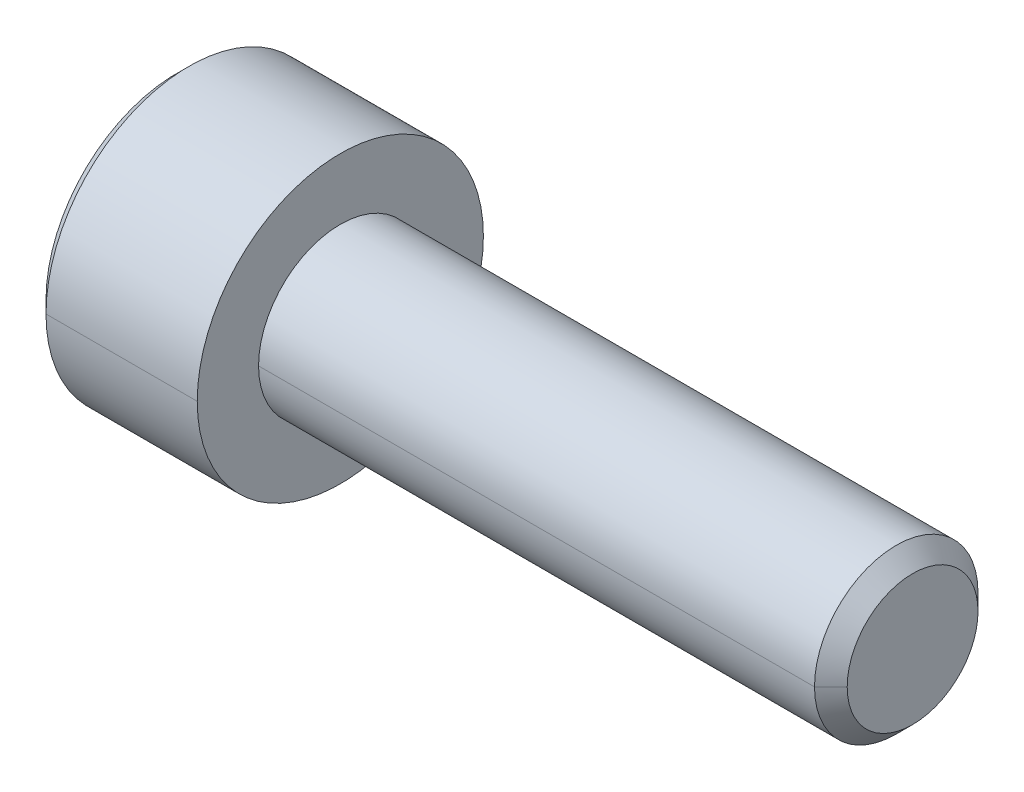
ISO-10303-21;
HEADER;
FILE_DESCRIPTION(('STEP AP214'),'2;1');
FILE_NAME('part.step','',(''),(''),'','','');
FILE_SCHEMA(('AUTOMOTIVE_DESIGN { 1 0 10303 214 1 1 1 1 }'));
ENDSEC;
DATA;
#1=APPLICATION_CONTEXT('core data for automotive mechanical design processes');
#2=APPLICATION_PROTOCOL_DEFINITION('international standard','automotive_design',2000,#1);
#3=PRODUCT_CONTEXT('',#1,'mechanical');
#4=PRODUCT('Part','Part','',(#3));
#5=PRODUCT_RELATED_PRODUCT_CATEGORY('part','',(#4));
#6=PRODUCT_DEFINITION_FORMATION('','',#4);
#7=PRODUCT_DEFINITION_CONTEXT('part definition',#1,'design');
#8=PRODUCT_DEFINITION('design','',#6,#7);
#9=PRODUCT_DEFINITION_SHAPE('','',#8);
#10=(LENGTH_UNIT() NAMED_UNIT(*) SI_UNIT(.MILLI.,.METRE.));
#11=(NAMED_UNIT(*) PLANE_ANGLE_UNIT() SI_UNIT($,.RADIAN.));
#12=(NAMED_UNIT(*) SI_UNIT($,.STERADIAN.) SOLID_ANGLE_UNIT());
#13=UNCERTAINTY_MEASURE_WITH_UNIT(LENGTH_MEASURE(1.E-05),#10,'distance_accuracy_value','');
#14=(GEOMETRIC_REPRESENTATION_CONTEXT(3) GLOBAL_UNCERTAINTY_ASSIGNED_CONTEXT((#13)) GLOBAL_UNIT_ASSIGNED_CONTEXT((#10,
#11,#12)) REPRESENTATION_CONTEXT('',''));
#15=CARTESIAN_POINT('',(0.,0.,0.));
#16=DIRECTION('',(0.,0.,1.));
#17=DIRECTION('',(1.,0.,0.));
#18=AXIS2_PLACEMENT_3D('',#15,#16,#17);
#19=CARTESIAN_POINT('',(-11.8339100346021,5.46584891523466,3.15570934256055));
#20=DIRECTION('',(0.882352941176471,-0.407541366486795,-0.235294117647059));
#21=DIRECTION('',(0.,0.5,-0.866025403784439));
#22=AXIS2_PLACEMENT_3D('',#19,#20,#21);
#23=PLANE('',#22);
#24=DIRECTION('',(0.419313934688767,0.453920649501602,0.786213627541439));
#25=VECTOR('',#24,1.);
#26=CARTESIAN_POINT('',(-16.,-0.866025403784439,-1.5));
#27=LINE('',#26,#25);
#28=CARTESIAN_POINT('',(-16.,-0.866025403784439,-1.5));
#29=VERTEX_POINT('',#28);
#30=CARTESIAN_POINT('',(-15.2,0.,0.));
#31=VERTEX_POINT('',#30);
#32=EDGE_CURVE('E157',#29,#31,#27,.T.);
#33=ORIENTED_EDGE('',*,*,#32,.F.);
#34=CARTESIAN_POINT('',(-16.,-0.866025403784439,-1.5));
#35=CARTESIAN_POINT('',(-16.,-1.15470053837925,-1.));
#36=CARTESIAN_POINT('',(-16.,-1.44337567297406,-0.5));
#37=CARTESIAN_POINT('',(-16.,-1.73205080756888,0.));
#38=(BOUNDED_CURVE() B_SPLINE_CURVE(3,(#34,#35,#36,#37),.UNSPECIFIED.,.F.,
.F.) B_SPLINE_CURVE_WITH_KNOTS((4,4),(0.,1.),
.UNSPECIFIED.) CURVE() GEOMETRIC_REPRESENTATION_ITEM() RATIONAL_B_SPLINE_CURVE((1.,1.,1.,1.)) REPRESENTATION_ITEM(''));
#39=CARTESIAN_POINT('',(-16.,-1.73205080756888,0.));
#40=VERTEX_POINT('',#39);
#41=EDGE_CURVE('E256',#29,#40,#38,.T.);
#42=ORIENTED_EDGE('',*,*,#41,.T.);
#43=DIRECTION('',(0.419313934688767,0.907841299003204,0.));
#44=VECTOR('',#43,1.);
#45=CARTESIAN_POINT('',(-16.,-1.73205080756888,0.));
#46=LINE('',#45,#44);
#47=EDGE_CURVE('E10',#40,#31,#46,.T.);
#48=ORIENTED_EDGE('',*,*,#47,.T.);
#49=EDGE_LOOP('',(#33,#42,#48));
#50=FACE_BOUND('',#49,.T.);
#51=ADVANCED_FACE('F16',(#50),#23,.F.);
#52=CARTESIAN_POINT('',(-11.8339100346021,5.46584891523466,-3.15570934256055));
#53=DIRECTION('',(0.882352941176471,-0.407541366486795,0.235294117647059));
#54=DIRECTION('',(0.,-0.5,-0.866025403784439));
#55=AXIS2_PLACEMENT_3D('',#52,#53,#54);
#56=PLANE('',#55);
#57=ORIENTED_EDGE('',*,*,#47,.F.);
#58=CARTESIAN_POINT('',(-16.,-1.73205080756888,0.));
#59=CARTESIAN_POINT('',(-16.,-1.44337567297407,0.5));
#60=CARTESIAN_POINT('',(-16.,-1.15470053837925,1.));
#61=CARTESIAN_POINT('',(-16.,-0.86602540378444,1.5));
#62=(BOUNDED_CURVE() B_SPLINE_CURVE(3,(#58,#59,#60,#61),.UNSPECIFIED.,.F.,
.F.) B_SPLINE_CURVE_WITH_KNOTS((4,4),(0.,1.),
.UNSPECIFIED.) CURVE() GEOMETRIC_REPRESENTATION_ITEM() RATIONAL_B_SPLINE_CURVE((1.,1.,1.,1.)) REPRESENTATION_ITEM(''));
#63=CARTESIAN_POINT('',(-16.,-0.86602540378444,1.5));
#64=VERTEX_POINT('',#63);
#65=EDGE_CURVE('E274',#40,#64,#62,.T.);
#66=ORIENTED_EDGE('',*,*,#65,.T.);
#67=DIRECTION('',(0.419313934688767,0.453920649501602,-0.786213627541438));
#68=VECTOR('',#67,1.);
#69=CARTESIAN_POINT('',(-16.,-0.86602540378444,1.5));
#70=LINE('',#69,#68);
#71=EDGE_CURVE('E27',#64,#31,#70,.T.);
#72=ORIENTED_EDGE('',*,*,#71,.T.);
#73=EDGE_LOOP('',(#57,#66,#72));
#74=FACE_BOUND('',#73,.T.);
#75=ADVANCED_FACE('F589',(#74),#56,.F.);
#76=CARTESIAN_POINT('',(-11.8339100346021,0.,-6.31141868512111));
#77=DIRECTION('',(0.882352941176471,0.,0.470588235294118));
#78=DIRECTION('',(0.,-1.,0.));
#79=AXIS2_PLACEMENT_3D('',#76,#77,#78);
#80=PLANE('',#79);
#81=ORIENTED_EDGE('',*,*,#71,.F.);
#82=CARTESIAN_POINT('',(-16.,-0.86602540378444,1.5));
#83=CARTESIAN_POINT('',(-16.,-0.288675134594814,1.5));
#84=CARTESIAN_POINT('',(-16.,0.288675134594813,1.5));
#85=CARTESIAN_POINT('',(-16.,0.866025403784439,1.5));
#86=(BOUNDED_CURVE() B_SPLINE_CURVE(3,(#82,#83,#84,#85),.UNSPECIFIED.,.F.,
.F.) B_SPLINE_CURVE_WITH_KNOTS((4,4),(0.,1.),
.UNSPECIFIED.) CURVE() GEOMETRIC_REPRESENTATION_ITEM() RATIONAL_B_SPLINE_CURVE((1.,1.,1.,1.)) REPRESENTATION_ITEM(''));
#87=CARTESIAN_POINT('',(-16.,0.866025403784439,1.5));
#88=VERTEX_POINT('',#87);
#89=EDGE_CURVE('E160',#64,#88,#86,.T.);
#90=ORIENTED_EDGE('',*,*,#89,.T.);
#91=DIRECTION('',(0.419313934688767,-0.453920649501602,-0.786213627541439));
#92=VECTOR('',#91,1.);
#93=CARTESIAN_POINT('',(-16.,0.866025403784439,1.5));
#94=LINE('',#93,#92);
#95=EDGE_CURVE('E149',#88,#31,#94,.T.);
#96=ORIENTED_EDGE('',*,*,#95,.T.);
#97=EDGE_LOOP('',(#81,#90,#96));
#98=FACE_BOUND('',#97,.T.);
#99=ADVANCED_FACE('F162',(#98),#80,.F.);
#100=CARTESIAN_POINT('',(-11.8339100346021,-5.46584891523466,-3.15570934256055));
#101=DIRECTION('',(0.882352941176471,0.407541366486795,0.235294117647059));
#102=DIRECTION('',(0.,0.5,-0.866025403784439));
#103=AXIS2_PLACEMENT_3D('',#100,#101,#102);
#104=PLANE('',#103);
#105=ORIENTED_EDGE('',*,*,#95,.F.);
#106=CARTESIAN_POINT('',(-16.,0.866025403784439,1.5));
#107=CARTESIAN_POINT('',(-16.,1.15470053837925,1.));
#108=CARTESIAN_POINT('',(-16.,1.44337567297406,0.5));
#109=CARTESIAN_POINT('',(-16.,1.73205080756888,0.));
#110=(BOUNDED_CURVE() B_SPLINE_CURVE(3,(#106,#107,#108,#109),.UNSPECIFIED.,.F.,
.F.) B_SPLINE_CURVE_WITH_KNOTS((4,4),(0.,1.),
.UNSPECIFIED.) CURVE() GEOMETRIC_REPRESENTATION_ITEM() RATIONAL_B_SPLINE_CURVE((1.,1.,1.,1.)) REPRESENTATION_ITEM(''));
#111=CARTESIAN_POINT('',(-16.,1.73205080756888,0.));
#112=VERTEX_POINT('',#111);
#113=EDGE_CURVE('E153',#88,#112,#110,.T.);
#114=ORIENTED_EDGE('',*,*,#113,.T.);
#115=DIRECTION('',(0.419313934688767,-0.907841299003204,0.));
#116=VECTOR('',#115,1.);
#117=CARTESIAN_POINT('',(-16.,1.73205080756888,0.));
#118=LINE('',#117,#116);
#119=EDGE_CURVE('E20',#112,#31,#118,.T.);
#120=ORIENTED_EDGE('',*,*,#119,.T.);
#121=EDGE_LOOP('',(#105,#114,#120));
#122=FACE_BOUND('',#121,.T.);
#123=ADVANCED_FACE('F151',(#122),#104,.F.);
#124=CARTESIAN_POINT('',(-11.8339100346021,0.,6.31141868512111));
#125=DIRECTION('',(0.882352941176471,0.,-0.470588235294118));
#126=DIRECTION('',(0.,-1.,0.));
#127=AXIS2_PLACEMENT_3D('',#124,#125,#126);
#128=PLANE('',#127);
#129=DIRECTION('',(0.419313934688767,-0.453920649501602,0.786213627541439));
#130=VECTOR('',#129,1.);
#131=CARTESIAN_POINT('',(-16.,0.866025403784439,-1.5));
#132=LINE('',#131,#130);
#133=CARTESIAN_POINT('',(-16.,0.866025403784439,-1.5));
#134=VERTEX_POINT('',#133);
#135=EDGE_CURVE('E213',#134,#31,#132,.T.);
#136=ORIENTED_EDGE('',*,*,#135,.F.);
#137=CARTESIAN_POINT('',(-16.,0.866025403784439,-1.5));
#138=CARTESIAN_POINT('',(-16.,0.288675134594813,-1.5));
#139=CARTESIAN_POINT('',(-16.,-0.288675134594813,-1.5));
#140=CARTESIAN_POINT('',(-16.,-0.866025403784439,-1.5));
#141=(BOUNDED_CURVE() B_SPLINE_CURVE(3,(#137,#138,#139,#140),.UNSPECIFIED.,.F.,
.F.) B_SPLINE_CURVE_WITH_KNOTS((4,4),(0.,1.),
.UNSPECIFIED.) CURVE() GEOMETRIC_REPRESENTATION_ITEM() RATIONAL_B_SPLINE_CURVE((1.,1.,1.,1.)) REPRESENTATION_ITEM(''));
#142=EDGE_CURVE('E190',#134,#29,#141,.T.);
#143=ORIENTED_EDGE('',*,*,#142,.T.);
#144=ORIENTED_EDGE('',*,*,#32,.T.);
#145=EDGE_LOOP('',(#136,#143,#144));
#146=FACE_BOUND('',#145,.T.);
#147=ADVANCED_FACE('F623',(#146),#128,.F.);
#148=CARTESIAN_POINT('',(-11.8339100346021,-5.46584891523466,3.15570934256055));
#149=DIRECTION('',(0.882352941176471,0.407541366486795,-0.235294117647059));
#150=DIRECTION('',(0.,-0.5,-0.866025403784439));
#151=AXIS2_PLACEMENT_3D('',#148,#149,#150);
#152=PLANE('',#151);
#153=ORIENTED_EDGE('',*,*,#119,.F.);
#154=CARTESIAN_POINT('',(-16.,1.73205080756888,0.));
#155=CARTESIAN_POINT('',(-16.,1.44337567297406,-0.5));
#156=CARTESIAN_POINT('',(-16.,1.15470053837925,-1.));
#157=CARTESIAN_POINT('',(-16.,0.866025403784439,-1.5));
#158=(BOUNDED_CURVE() B_SPLINE_CURVE(3,(#154,#155,#156,#157),.UNSPECIFIED.,.F.,
.F.) B_SPLINE_CURVE_WITH_KNOTS((4,4),(0.,1.),
.UNSPECIFIED.) CURVE() GEOMETRIC_REPRESENTATION_ITEM() RATIONAL_B_SPLINE_CURVE((1.,1.,1.,1.)) REPRESENTATION_ITEM(''));
#159=EDGE_CURVE('E207',#112,#134,#158,.T.);
#160=ORIENTED_EDGE('',*,*,#159,.T.);
#161=ORIENTED_EDGE('',*,*,#135,.T.);
#162=EDGE_LOOP('',(#153,#160,#161));
#163=FACE_BOUND('',#162,.T.);
#164=ADVANCED_FACE('F617',(#163),#152,.F.);
#165=CARTESIAN_POINT('',(-18.,0.,0.));
#166=DIRECTION('',(1.,0.,0.));
#167=DIRECTION('',(0.,0.,-1.));
#168=AXIS2_PLACEMENT_3D('',#165,#166,#167);
#169=CONICAL_SURFACE('',#168,3.2,0.785398163397441);
#170=DIRECTION('',(0.707106781186553,0.,0.707106781186543));
#171=VECTOR('',#170,1.);
#172=CARTESIAN_POINT('',(-18.,0.,3.2));
#173=LINE('',#172,#171);
#174=CARTESIAN_POINT('',(-18.,0.,3.2));
#175=VERTEX_POINT('',#174);
#176=CARTESIAN_POINT('',(-17.7,0.,3.5));
#177=VERTEX_POINT('',#176);
#178=EDGE_CURVE('E202',#175,#177,#173,.T.);
#179=ORIENTED_EDGE('',*,*,#178,.F.);
#180=CARTESIAN_POINT('',(-18.,0.,0.));
#181=DIRECTION('',(-1.,0.,0.));
#182=DIRECTION('',(0.,0.,-1.));
#183=AXIS2_PLACEMENT_3D('',#180,#181,#182);
#184=CIRCLE('',#183,3.2);
#185=CARTESIAN_POINT('',(-18.,0.,-3.2));
#186=VERTEX_POINT('',#185);
#187=EDGE_CURVE('E394',#186,#175,#184,.T.);
#188=ORIENTED_EDGE('',*,*,#187,.F.);
#189=DIRECTION('',(0.707106781186553,0.,-0.707106781186543));
#190=VECTOR('',#189,1.);
#191=CARTESIAN_POINT('',(-18.,0.,-3.2));
#192=LINE('',#191,#190);
#193=CARTESIAN_POINT('',(-17.7,0.,-3.5));
#194=VERTEX_POINT('',#193);
#195=EDGE_CURVE('E201',#186,#194,#192,.T.);
#196=ORIENTED_EDGE('',*,*,#195,.T.);
#197=CARTESIAN_POINT('',(-17.7,0.,0.));
#198=DIRECTION('',(1.,0.,0.));
#199=DIRECTION('',(0.,0.,-1.));
#200=AXIS2_PLACEMENT_3D('',#197,#198,#199);
#201=CIRCLE('',#200,3.5);
#202=EDGE_CURVE('E359',#177,#194,#201,.T.);
#203=ORIENTED_EDGE('',*,*,#202,.F.);
#204=EDGE_LOOP('',(#179,#188,#196,#203));
#205=FACE_BOUND('',#204,.T.);
#206=ADVANCED_FACE('F567',(#205),#169,.T.);
#207=CARTESIAN_POINT('',(-16.,1.73205080756888,0.));
#208=DIRECTION('',(0.,0.866025403784439,-0.5));
#209=DIRECTION('',(-1.,0.,0.));
#210=AXIS2_PLACEMENT_3D('',#207,#208,#209);
#211=PLANE('',#210);
#212=DIRECTION('',(0.,-0.5,-0.866025403784439));
#213=VECTOR('',#212,1.);
#214=CARTESIAN_POINT('',(-18.,1.73205080756888,0.));
#215=LINE('',#214,#213);
#216=CARTESIAN_POINT('',(-18.,1.73205080756888,0.));
#217=VERTEX_POINT('',#216);
#218=CARTESIAN_POINT('',(-18.,0.866025403784439,-1.5));
#219=VERTEX_POINT('',#218);
#220=EDGE_CURVE('E390',#217,#219,#215,.T.);
#221=ORIENTED_EDGE('',*,*,#220,.T.);
#222=DIRECTION('',(-1.,0.,0.));
#223=VECTOR('',#222,1.);
#224=CARTESIAN_POINT('',(-16.,0.866025403784439,-1.5));
#225=LINE('',#224,#223);
#226=EDGE_CURVE('E212',#134,#219,#225,.T.);
#227=ORIENTED_EDGE('',*,*,#226,.F.);
#228=ORIENTED_EDGE('',*,*,#159,.F.);
#229=DIRECTION('',(-1.,0.,0.));
#230=VECTOR('',#229,1.);
#231=CARTESIAN_POINT('',(-16.,1.73205080756888,0.));
#232=LINE('',#231,#230);
#233=EDGE_CURVE('E100',#112,#217,#232,.T.);
#234=ORIENTED_EDGE('',*,*,#233,.T.);
#235=EDGE_LOOP('',(#221,#227,#228,#234));
#236=FACE_BOUND('',#235,.T.);
#237=ADVANCED_FACE('F616',(#236),#211,.F.);
#238=CARTESIAN_POINT('',(-16.,0.866025403784439,-1.5));
#239=DIRECTION('',(0.,0.,-1.));
#240=DIRECTION('',(0.,-1.,0.));
#241=AXIS2_PLACEMENT_3D('',#238,#239,#240);
#242=PLANE('',#241);
#243=DIRECTION('',(0.,-1.,0.));
#244=VECTOR('',#243,1.);
#245=CARTESIAN_POINT('',(-18.,0.866025403784439,-1.5));
#246=LINE('',#245,#244);
#247=CARTESIAN_POINT('',(-18.,-0.866025403784439,-1.5));
#248=VERTEX_POINT('',#247);
#249=EDGE_CURVE('E184',#219,#248,#246,.T.);
#250=ORIENTED_EDGE('',*,*,#249,.T.);
#251=DIRECTION('',(-1.,0.,0.));
#252=VECTOR('',#251,1.);
#253=CARTESIAN_POINT('',(-16.,-0.866025403784439,-1.5));
#254=LINE('',#253,#252);
#255=EDGE_CURVE('E249',#29,#248,#254,.T.);
#256=ORIENTED_EDGE('',*,*,#255,.F.);
#257=ORIENTED_EDGE('',*,*,#142,.F.);
#258=ORIENTED_EDGE('',*,*,#226,.T.);
#259=EDGE_LOOP('',(#250,#256,#257,#258));
#260=FACE_BOUND('',#259,.T.);
#261=ADVANCED_FACE('F622',(#260),#242,.F.);
#262=CARTESIAN_POINT('',(-16.,-0.866025403784439,-1.5));
#263=DIRECTION('',(0.,-0.866025403784439,-0.5));
#264=DIRECTION('',(0.,0.5,-0.866025403784439));
#265=AXIS2_PLACEMENT_3D('',#262,#263,#264);
#266=PLANE('',#265);
#267=DIRECTION('',(0.,-0.5,0.866025403784439));
#268=VECTOR('',#267,1.);
#269=CARTESIAN_POINT('',(-18.,-0.866025403784439,-1.5));
#270=LINE('',#269,#268);
#271=CARTESIAN_POINT('',(-18.,-1.73205080756888,0.));
#272=VERTEX_POINT('',#271);
#273=EDGE_CURVE('E365',#248,#272,#270,.T.);
#274=ORIENTED_EDGE('',*,*,#273,.T.);
#275=DIRECTION('',(-1.,0.,0.));
#276=VECTOR('',#275,1.);
#277=CARTESIAN_POINT('',(-16.,-1.73205080756888,0.));
#278=LINE('',#277,#276);
#279=EDGE_CURVE('E265',#40,#272,#278,.T.);
#280=ORIENTED_EDGE('',*,*,#279,.F.);
#281=ORIENTED_EDGE('',*,*,#41,.F.);
#282=ORIENTED_EDGE('',*,*,#255,.T.);
#283=EDGE_LOOP('',(#274,#280,#281,#282));
#284=FACE_BOUND('',#283,.T.);
#285=ADVANCED_FACE('F613',(#284),#266,.F.);
#286=CARTESIAN_POINT('',(-16.,-1.73205080756888,0.));
#287=DIRECTION('',(0.,-0.866025403784439,0.5));
#288=DIRECTION('',(-1.,0.,0.));
#289=AXIS2_PLACEMENT_3D('',#286,#287,#288);
#290=PLANE('',#289);
#291=DIRECTION('',(0.,0.5,0.866025403784439));
#292=VECTOR('',#291,1.);
#293=CARTESIAN_POINT('',(-18.,-1.73205080756888,0.));
#294=LINE('',#293,#292);
#295=CARTESIAN_POINT('',(-18.,-0.86602540378444,1.5));
#296=VERTEX_POINT('',#295);
#297=EDGE_CURVE('E339',#272,#296,#294,.T.);
#298=ORIENTED_EDGE('',*,*,#297,.T.);
#299=DIRECTION('',(-1.,0.,0.));
#300=VECTOR('',#299,1.);
#301=CARTESIAN_POINT('',(-16.,-0.86602540378444,1.5));
#302=LINE('',#301,#300);
#303=EDGE_CURVE('E166',#64,#296,#302,.T.);
#304=ORIENTED_EDGE('',*,*,#303,.F.);
#305=ORIENTED_EDGE('',*,*,#65,.F.);
#306=ORIENTED_EDGE('',*,*,#279,.T.);
#307=EDGE_LOOP('',(#298,#304,#305,#306));
#308=FACE_BOUND('',#307,.T.);
#309=ADVANCED_FACE('F609',(#308),#290,.F.);
#310=CARTESIAN_POINT('',(-16.,-0.86602540378444,1.5));
#311=DIRECTION('',(0.,0.,1.));
#312=DIRECTION('',(0.,-1.,0.));
#313=AXIS2_PLACEMENT_3D('',#310,#311,#312);
#314=PLANE('',#313);
#315=DIRECTION('',(0.,1.,0.));
#316=VECTOR('',#315,1.);
#317=CARTESIAN_POINT('',(-18.,-0.86602540378444,1.5));
#318=LINE('',#317,#316);
#319=CARTESIAN_POINT('',(-18.,0.866025403784439,1.5));
#320=VERTEX_POINT('',#319);
#321=EDGE_CURVE('E172',#296,#320,#318,.T.);
#322=ORIENTED_EDGE('',*,*,#321,.T.);
#323=DIRECTION('',(-1.,0.,0.));
#324=VECTOR('',#323,1.);
#325=CARTESIAN_POINT('',(-16.,0.866025403784439,1.5));
#326=LINE('',#325,#324);
#327=EDGE_CURVE('E167',#88,#320,#326,.T.);
#328=ORIENTED_EDGE('',*,*,#327,.F.);
#329=ORIENTED_EDGE('',*,*,#89,.F.);
#330=ORIENTED_EDGE('',*,*,#303,.T.);
#331=EDGE_LOOP('',(#322,#328,#329,#330));
#332=FACE_BOUND('',#331,.T.);
#333=ADVANCED_FACE('F170',(#332),#314,.F.);
#334=CARTESIAN_POINT('',(-16.,0.866025403784439,1.5));
#335=DIRECTION('',(0.,0.866025403784439,0.5));
#336=DIRECTION('',(1.,0.,0.));
#337=AXIS2_PLACEMENT_3D('',#334,#335,#336);
#338=PLANE('',#337);
#339=DIRECTION('',(0.,0.5,-0.866025403784439));
#340=VECTOR('',#339,1.);
#341=CARTESIAN_POINT('',(-18.,0.866025403784439,1.5));
#342=LINE('',#341,#340);
#343=EDGE_CURVE('E340',#320,#217,#342,.T.);
#344=ORIENTED_EDGE('',*,*,#343,.T.);
#345=ORIENTED_EDGE('',*,*,#233,.F.);
#346=ORIENTED_EDGE('',*,*,#113,.F.);
#347=ORIENTED_EDGE('',*,*,#327,.T.);
#348=EDGE_LOOP('',(#344,#345,#346,#347));
#349=FACE_BOUND('',#348,.T.);
#350=ADVANCED_FACE('F177',(#349),#338,.F.);
#351=CARTESIAN_POINT('',(-0.4,0.,0.));
#352=DIRECTION('',(-1.,0.,0.));
#353=DIRECTION('',(0.,0.,1.));
#354=AXIS2_PLACEMENT_3D('',#351,#352,#353);
#355=CONICAL_SURFACE('',#354,2.,0.785398163397452);
#356=DIRECTION('',(-0.707106781186545,0.,-0.707106781186551));
#357=VECTOR('',#356,1.);
#358=CARTESIAN_POINT('',(-0.4,0.,-2.));
#359=LINE('',#358,#357);
#360=CARTESIAN_POINT('',(0.,0.,-1.6));
#361=VERTEX_POINT('',#360);
#362=CARTESIAN_POINT('',(-0.4,0.,-2.));
#363=VERTEX_POINT('',#362);
#364=EDGE_CURVE('E428',#361,#363,#359,.T.);
#365=ORIENTED_EDGE('',*,*,#364,.F.);
#366=CARTESIAN_POINT('',(0.,0.,0.));
#367=DIRECTION('',(1.,0.,0.));
#368=DIRECTION('',(0.,0.,1.));
#369=AXIS2_PLACEMENT_3D('',#366,#367,#368);
#370=CIRCLE('',#369,1.6);
#371=CARTESIAN_POINT('',(0.,0.,1.6));
#372=VERTEX_POINT('',#371);
#373=EDGE_CURVE('E329',#372,#361,#370,.T.);
#374=ORIENTED_EDGE('',*,*,#373,.F.);
#375=DIRECTION('',(-0.707106781186545,0.,0.707106781186551));
#376=VECTOR('',#375,1.);
#377=CARTESIAN_POINT('',(-0.4,0.,2.));
#378=LINE('',#377,#376);
#379=CARTESIAN_POINT('',(-0.4,0.,2.));
#380=VERTEX_POINT('',#379);
#381=EDGE_CURVE('E317',#372,#380,#378,.T.);
#382=ORIENTED_EDGE('',*,*,#381,.T.);
#383=CARTESIAN_POINT('',(-0.4,0.,0.));
#384=DIRECTION('',(-1.,0.,0.));
#385=DIRECTION('',(0.,0.,1.));
#386=AXIS2_PLACEMENT_3D('',#383,#384,#385);
#387=CIRCLE('',#386,2.);
#388=EDGE_CURVE('E324',#363,#380,#387,.T.);
#389=ORIENTED_EDGE('',*,*,#388,.F.);
#390=EDGE_LOOP('',(#365,#374,#382,#389));
#391=FACE_BOUND('',#390,.T.);
#392=ADVANCED_FACE('F575',(#391),#355,.T.);
#393=CARTESIAN_POINT('',(-18.,3.5,0.));
#394=DIRECTION('',(1.,0.,0.));
#395=DIRECTION('',(0.,1.,0.));
#396=AXIS2_PLACEMENT_3D('',#393,#394,#395);
#397=PLANE('',#396);
#398=ORIENTED_EDGE('',*,*,#220,.F.);
#399=ORIENTED_EDGE('',*,*,#343,.F.);
#400=ORIENTED_EDGE('',*,*,#321,.F.);
#401=ORIENTED_EDGE('',*,*,#297,.F.);
#402=ORIENTED_EDGE('',*,*,#273,.F.);
#403=ORIENTED_EDGE('',*,*,#249,.F.);
#404=EDGE_LOOP('',(#398,#399,#400,#401,#402,#403));
#405=FACE_BOUND('',#404,.T.);
#406=ORIENTED_EDGE('',*,*,#187,.T.);
#407=CARTESIAN_POINT('',(-18.,0.,0.));
#408=DIRECTION('',(-1.,0.,0.));
#409=DIRECTION('',(0.,0.,-1.));
#410=AXIS2_PLACEMENT_3D('',#407,#408,#409);
#411=CIRCLE('',#410,3.2);
#412=EDGE_CURVE('E206',#175,#186,#411,.T.);
#413=ORIENTED_EDGE('',*,*,#412,.T.);
#414=EDGE_LOOP('',(#406,#413));
#415=FACE_BOUND('',#414,.T.);
#416=ADVANCED_FACE('F573',(#405,#415),#397,.F.);
#417=CARTESIAN_POINT('',(0.,0.,0.));
#418=DIRECTION('',(-1.,0.,0.));
#419=DIRECTION('',(0.,0.,1.));
#420=AXIS2_PLACEMENT_3D('',#417,#418,#419);
#421=CYLINDRICAL_SURFACE('',#420,3.5);
#422=DIRECTION('',(-1.,0.,0.));
#423=VECTOR('',#422,1.);
#424=CARTESIAN_POINT('',(0.,0.,-3.5));
#425=LINE('',#424,#423);
#426=CARTESIAN_POINT('',(-14.,0.,-3.5));
#427=VERTEX_POINT('',#426);
#428=EDGE_CURVE('E316',#427,#194,#425,.T.);
#429=ORIENTED_EDGE('',*,*,#428,.F.);
#430=CARTESIAN_POINT('',(-14.,0.,0.));
#431=DIRECTION('',(-1.,0.,0.));
#432=DIRECTION('',(0.,0.,1.));
#433=AXIS2_PLACEMENT_3D('',#430,#431,#432);
#434=CIRCLE('',#433,3.5);
#435=CARTESIAN_POINT('',(-14.,0.,3.5));
#436=VERTEX_POINT('',#435);
#437=EDGE_CURVE('E355',#427,#436,#434,.T.);
#438=ORIENTED_EDGE('',*,*,#437,.T.);
#439=DIRECTION('',(-1.,0.,0.));
#440=VECTOR('',#439,1.);
#441=CARTESIAN_POINT('',(0.,0.,3.5));
#442=LINE('',#441,#440);
#443=EDGE_CURVE('E411',#436,#177,#442,.T.);
#444=ORIENTED_EDGE('',*,*,#443,.T.);
#445=ORIENTED_EDGE('',*,*,#202,.T.);
#446=EDGE_LOOP('',(#429,#438,#444,#445));
#447=FACE_BOUND('',#446,.T.);
#448=ADVANCED_FACE('F557',(#447),#421,.T.);
#449=CARTESIAN_POINT('',(-14.,2.,0.));
#450=DIRECTION('',(-1.,0.,0.));
#451=DIRECTION('',(0.,0.,1.));
#452=AXIS2_PLACEMENT_3D('',#449,#450,#451);
#453=PLANE('',#452);
#454=CARTESIAN_POINT('',(-14.,0.,0.));
#455=DIRECTION('',(-1.,0.,0.));
#456=DIRECTION('',(0.,0.,1.));
#457=AXIS2_PLACEMENT_3D('',#454,#455,#456);
#458=CIRCLE('',#457,2.);
#459=CARTESIAN_POINT('',(-14.,0.,2.));
#460=VERTEX_POINT('',#459);
#461=CARTESIAN_POINT('',(-14.,0.,-2.));
#462=VERTEX_POINT('',#461);
#463=EDGE_CURVE('E416',#460,#462,#458,.T.);
#464=ORIENTED_EDGE('',*,*,#463,.T.);
#465=CARTESIAN_POINT('',(-14.,0.,0.));
#466=DIRECTION('',(-1.,0.,0.));
#467=DIRECTION('',(0.,0.,1.));
#468=AXIS2_PLACEMENT_3D('',#465,#466,#467);
#469=CIRCLE('',#468,2.);
#470=EDGE_CURVE('E115',#462,#460,#469,.T.);
#471=ORIENTED_EDGE('',*,*,#470,.T.);
#472=EDGE_LOOP('',(#464,#471));
#473=FACE_BOUND('',#472,.T.);
#474=CARTESIAN_POINT('',(-14.,0.,0.));
#475=DIRECTION('',(-1.,0.,0.));
#476=DIRECTION('',(0.,0.,1.));
#477=AXIS2_PLACEMENT_3D('',#474,#475,#476);
#478=CIRCLE('',#477,3.5);
#479=EDGE_CURVE('E311',#436,#427,#478,.T.);
#480=ORIENTED_EDGE('',*,*,#479,.F.);
#481=ORIENTED_EDGE('',*,*,#437,.F.);
#482=EDGE_LOOP('',(#480,#481));
#483=FACE_BOUND('',#482,.T.);
#484=ADVANCED_FACE('F18',(#473,#483),#453,.F.);
#485=CARTESIAN_POINT('',(0.,0.,0.));
#486=DIRECTION('',(-1.,0.,0.));
#487=DIRECTION('',(0.,0.,1.));
#488=AXIS2_PLACEMENT_3D('',#485,#486,#487);
#489=CYLINDRICAL_SURFACE('',#488,2.);
#490=DIRECTION('',(-1.,0.,0.));
#491=VECTOR('',#490,1.);
#492=CARTESIAN_POINT('',(0.,0.,-2.));
#493=LINE('',#492,#491);
#494=EDGE_CURVE('E420',#363,#462,#493,.T.);
#495=ORIENTED_EDGE('',*,*,#494,.F.);
#496=ORIENTED_EDGE('',*,*,#388,.T.);
#497=DIRECTION('',(-1.,0.,0.));
#498=VECTOR('',#497,1.);
#499=CARTESIAN_POINT('',(0.,0.,2.));
#500=LINE('',#499,#498);
#501=EDGE_CURVE('E349',#380,#460,#500,.T.);
#502=ORIENTED_EDGE('',*,*,#501,.T.);
#503=ORIENTED_EDGE('',*,*,#470,.F.);
#504=EDGE_LOOP('',(#495,#496,#502,#503));
#505=FACE_BOUND('',#504,.T.);
#506=ADVANCED_FACE('F554',(#505),#489,.T.);
#507=CARTESIAN_POINT('',(0.,0.,0.));
#508=DIRECTION('',(-1.,0.,0.));
#509=DIRECTION('',(0.,0.,1.));
#510=AXIS2_PLACEMENT_3D('',#507,#508,#509);
#511=PLANE('',#510);
#512=ORIENTED_EDGE('',*,*,#373,.T.);
#513=CARTESIAN_POINT('',(0.,0.,0.));
#514=DIRECTION('',(1.,0.,0.));
#515=DIRECTION('',(0.,0.,1.));
#516=AXIS2_PLACEMENT_3D('',#513,#514,#515);
#517=CIRCLE('',#516,1.6);
#518=EDGE_CURVE('E406',#361,#372,#517,.T.);
#519=ORIENTED_EDGE('',*,*,#518,.T.);
#520=EDGE_LOOP('',(#512,#519));
#521=FACE_BOUND('',#520,.T.);
#522=ADVANCED_FACE('F600',(#521),#511,.F.);
#523=CARTESIAN_POINT('',(0.,0.,0.));
#524=DIRECTION('',(-1.,0.,0.));
#525=DIRECTION('',(0.,0.,1.));
#526=AXIS2_PLACEMENT_3D('',#523,#524,#525);
#527=CYLINDRICAL_SURFACE('',#526,2.);
#528=CARTESIAN_POINT('',(-0.4,0.,0.));
#529=DIRECTION('',(-1.,0.,0.));
#530=DIRECTION('',(0.,0.,1.));
#531=AXIS2_PLACEMENT_3D('',#528,#529,#530);
#532=CIRCLE('',#531,2.);
#533=EDGE_CURVE('E439',#380,#363,#532,.T.);
#534=ORIENTED_EDGE('',*,*,#533,.T.);
#535=ORIENTED_EDGE('',*,*,#494,.T.);
#536=ORIENTED_EDGE('',*,*,#463,.F.);
#537=ORIENTED_EDGE('',*,*,#501,.F.);
#538=EDGE_LOOP('',(#534,#535,#536,#537));
#539=FACE_BOUND('',#538,.T.);
#540=ADVANCED_FACE('F550',(#539),#527,.T.);
#541=CARTESIAN_POINT('',(0.,0.,0.));
#542=DIRECTION('',(-1.,0.,0.));
#543=DIRECTION('',(0.,0.,1.));
#544=AXIS2_PLACEMENT_3D('',#541,#542,#543);
#545=CYLINDRICAL_SURFACE('',#544,3.5);
#546=ORIENTED_EDGE('',*,*,#479,.T.);
#547=ORIENTED_EDGE('',*,*,#428,.T.);
#548=CARTESIAN_POINT('',(-17.7,0.,0.));
#549=DIRECTION('',(1.,0.,0.));
#550=DIRECTION('',(0.,0.,-1.));
#551=AXIS2_PLACEMENT_3D('',#548,#549,#550);
#552=CIRCLE('',#551,3.5);
#553=EDGE_CURVE('E194',#194,#177,#552,.T.);
#554=ORIENTED_EDGE('',*,*,#553,.T.);
#555=ORIENTED_EDGE('',*,*,#443,.F.);
#556=EDGE_LOOP('',(#546,#547,#554,#555));
#557=FACE_BOUND('',#556,.T.);
#558=ADVANCED_FACE('F562',(#557),#545,.T.);
#559=CARTESIAN_POINT('',(-0.4,0.,0.));
#560=DIRECTION('',(-1.,0.,0.));
#561=DIRECTION('',(0.,0.,1.));
#562=AXIS2_PLACEMENT_3D('',#559,#560,#561);
#563=CONICAL_SURFACE('',#562,2.,0.785398163397452);
#564=ORIENTED_EDGE('',*,*,#518,.F.);
#565=ORIENTED_EDGE('',*,*,#364,.T.);
#566=ORIENTED_EDGE('',*,*,#533,.F.);
#567=ORIENTED_EDGE('',*,*,#381,.F.);
#568=EDGE_LOOP('',(#564,#565,#566,#567));
#569=FACE_BOUND('',#568,.T.);
#570=ADVANCED_FACE('F603',(#569),#563,.T.);
#571=CARTESIAN_POINT('',(-18.,0.,0.));
#572=DIRECTION('',(1.,0.,0.));
#573=DIRECTION('',(0.,0.,-1.));
#574=AXIS2_PLACEMENT_3D('',#571,#572,#573);
#575=CONICAL_SURFACE('',#574,3.2,0.785398163397441);
#576=ORIENTED_EDGE('',*,*,#412,.F.);
#577=ORIENTED_EDGE('',*,*,#178,.T.);
#578=ORIENTED_EDGE('',*,*,#553,.F.);
#579=ORIENTED_EDGE('',*,*,#195,.F.);
#580=EDGE_LOOP('',(#576,#577,#578,#579));
#581=FACE_BOUND('',#580,.T.);
#582=ADVANCED_FACE('F571',(#581),#575,.T.);
#583=CLOSED_SHELL('',(#51,#75,#99,#123,#147,#164,#206,#237,#261,#285,#309,#333,#350,#392,#416,
#448,#484,#506,#522,#540,#558,#570,#582));
#584=MANIFOLD_SOLID_BREP('B1',#583);
#585=ADVANCED_BREP_SHAPE_REPRESENTATION('',(#18,#584),#14);
#586=SHAPE_DEFINITION_REPRESENTATION(#9,#585);
ENDSEC;
END-ISO-10303-21;
